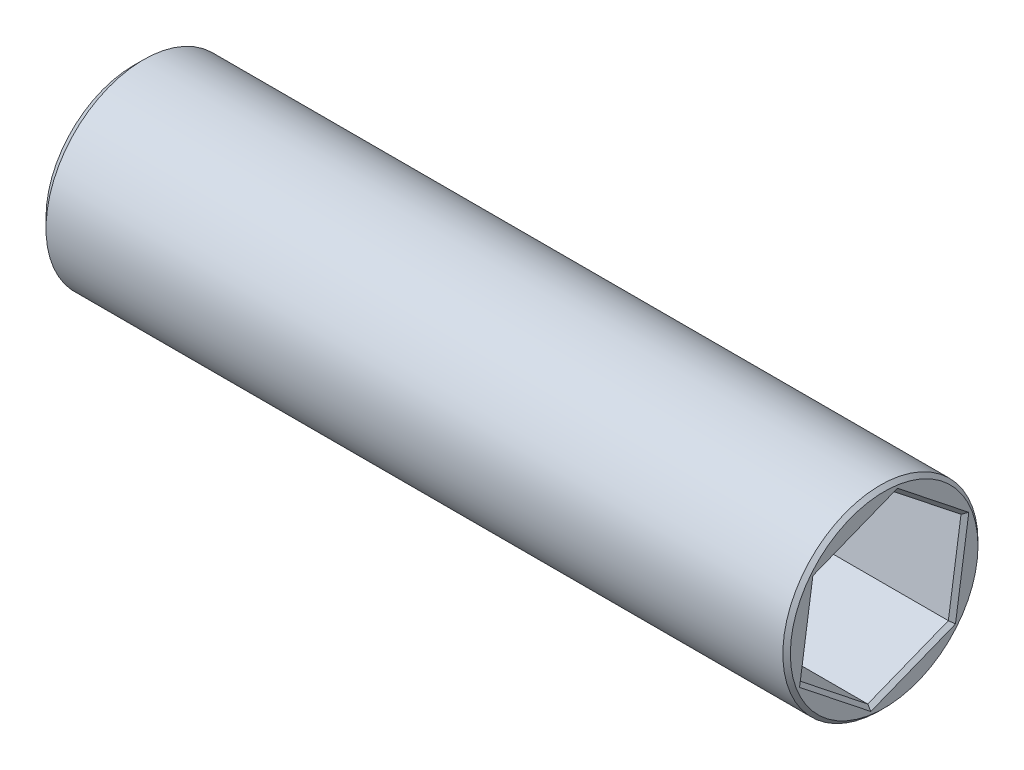
ISO-10303-21;
HEADER;
FILE_DESCRIPTION(('STEP AP214'),'2;1');
FILE_NAME('part.step','',(''),(''),'','','');
FILE_SCHEMA(('AUTOMOTIVE_DESIGN { 1 0 10303 214 1 1 1 1 }'));
ENDSEC;
DATA;
#1=APPLICATION_CONTEXT('core data for automotive mechanical design processes');
#2=APPLICATION_PROTOCOL_DEFINITION('international standard','automotive_design',2000,#1);
#3=PRODUCT_CONTEXT('',#1,'mechanical');
#4=PRODUCT('Part','Part','',(#3));
#5=PRODUCT_RELATED_PRODUCT_CATEGORY('part','',(#4));
#6=PRODUCT_DEFINITION_FORMATION('','',#4);
#7=PRODUCT_DEFINITION_CONTEXT('part definition',#1,'design');
#8=PRODUCT_DEFINITION('design','',#6,#7);
#9=PRODUCT_DEFINITION_SHAPE('','',#8);
#10=(LENGTH_UNIT() NAMED_UNIT(*) SI_UNIT(.MILLI.,.METRE.));
#11=(NAMED_UNIT(*) PLANE_ANGLE_UNIT() SI_UNIT($,.RADIAN.));
#12=(NAMED_UNIT(*) SI_UNIT($,.STERADIAN.) SOLID_ANGLE_UNIT());
#13=UNCERTAINTY_MEASURE_WITH_UNIT(LENGTH_MEASURE(1.E-05),#10,'distance_accuracy_value','');
#14=(GEOMETRIC_REPRESENTATION_CONTEXT(3) GLOBAL_UNCERTAINTY_ASSIGNED_CONTEXT((#13)) GLOBAL_UNIT_ASSIGNED_CONTEXT((#10,
#11,#12)) REPRESENTATION_CONTEXT('',''));
#15=CARTESIAN_POINT('',(0.,0.,0.));
#16=DIRECTION('',(0.,0.,1.));
#17=DIRECTION('',(1.,0.,0.));
#18=AXIS2_PLACEMENT_3D('',#15,#16,#17);
#19=CARTESIAN_POINT('',(30.,0.,0.));
#20=DIRECTION('',(-1.,0.,0.));
#21=DIRECTION('',(0.,0.,1.));
#22=AXIS2_PLACEMENT_3D('',#19,#20,#21);
#23=CYLINDRICAL_SURFACE('',#22,1.575);
#24=CARTESIAN_POINT('',(0.400000000000005,0.,0.));
#25=DIRECTION('',(1.,0.,0.));
#26=DIRECTION('',(0.,0.,-1.));
#27=AXIS2_PLACEMENT_3D('',#24,#25,#26);
#28=CIRCLE('',#27,1.575);
#29=CARTESIAN_POINT('',(0.400000000000005,0.,-1.575));
#30=VERTEX_POINT('',#29);
#31=EDGE_CURVE('E167',#30,#30,#28,.F.);
#32=ORIENTED_EDGE('',*,*,#31,.T.);
#33=EDGE_LOOP('',(#32));
#34=FACE_BOUND('',#33,.T.);
#35=CARTESIAN_POINT('',(5.,0.,0.));
#36=DIRECTION('',(1.,0.,0.));
#37=DIRECTION('',(0.,0.,-1.));
#38=AXIS2_PLACEMENT_3D('',#35,#36,#37);
#39=CIRCLE('',#38,1.575);
#40=CARTESIAN_POINT('',(5.,0.,-1.575));
#41=VERTEX_POINT('',#40);
#42=EDGE_CURVE('E149',#41,#41,#39,.T.);
#43=ORIENTED_EDGE('',*,*,#42,.T.);
#44=EDGE_LOOP('',(#43));
#45=FACE_BOUND('',#44,.T.);
#46=ADVANCED_FACE('F43',(#34,#45),#23,.F.);
#47=CARTESIAN_POINT('',(30.,0.,0.));
#48=DIRECTION('',(1.,0.,0.));
#49=DIRECTION('',(0.,0.,-1.));
#50=AXIS2_PLACEMENT_3D('',#47,#48,#49);
#51=PLANE('',#50);
#52=CARTESIAN_POINT('',(30.,0.,0.));
#53=DIRECTION('',(1.,0.,0.));
#54=DIRECTION('',(0.,0.,-1.));
#55=AXIS2_PLACEMENT_3D('',#52,#53,#54);
#56=CIRCLE('',#55,3.75);
#57=CARTESIAN_POINT('',(30.,0.,-3.75));
#58=VERTEX_POINT('',#57);
#59=EDGE_CURVE('E194',#58,#58,#56,.T.);
#60=ORIENTED_EDGE('',*,*,#59,.T.);
#61=EDGE_LOOP('',(#60));
#62=FACE_BOUND('',#61,.T.);
#63=DIRECTION('',(0.,0.989246253884702,-0.146259526784012));
#64=VECTOR('',#63,1.);
#65=CARTESIAN_POINT('',(30.,2.17414228229512,2.86279676825592));
#66=LINE('',#65,#64);
#67=CARTESIAN_POINT('',(30.,-1.33837850220212,3.38212107779175));
#68=VERTEX_POINT('',#67);
#69=CARTESIAN_POINT('',(30.,2.2598135209414,2.85013032168188));
#70=VERTEX_POINT('',#69);
#71=EDGE_CURVE('E187',#68,#70,#66,.T.);
#72=ORIENTED_EDGE('',*,*,#71,.T.);
#73=DIRECTION('',(0.,0.367958661201907,-0.929842149854749));
#74=VECTOR('',#73,1.);
#75=CARTESIAN_POINT('',(30.,3.56632586832918,-0.451464063781495));
#76=LINE('',#75,#74);
#77=CARTESIAN_POINT('',(30.,3.59819202314352,-0.531990756109868));
#78=VERTEX_POINT('',#77);
#79=EDGE_CURVE('E190',#70,#78,#76,.T.);
#80=ORIENTED_EDGE('',*,*,#79,.T.);
#81=DIRECTION('',(0.,-0.621287592682796,-0.783582623070737));
#82=VECTOR('',#81,1.);
#83=CARTESIAN_POINT('',(30.,1.39218358603406,-3.31426083203742));
#84=LINE('',#83,#82);
#85=CARTESIAN_POINT('',(30.,1.33837850220212,-3.38212107779175));
#86=VERTEX_POINT('',#85);
#87=EDGE_CURVE('E175',#78,#86,#84,.T.);
#88=ORIENTED_EDGE('',*,*,#87,.T.);
#89=DIRECTION('',(0.,-0.989246253884702,0.146259526784012));
#90=VECTOR('',#89,1.);
#91=CARTESIAN_POINT('',(30.,-2.17414228229512,-2.86279676825592));
#92=LINE('',#91,#90);
#93=CARTESIAN_POINT('',(30.,-2.2598135209414,-2.85013032168188));
#94=VERTEX_POINT('',#93);
#95=EDGE_CURVE('E178',#86,#94,#92,.T.);
#96=ORIENTED_EDGE('',*,*,#95,.T.);
#97=DIRECTION('',(0.,-0.367958661201906,0.929842149854749));
#98=VECTOR('',#97,1.);
#99=CARTESIAN_POINT('',(30.,-3.56632586832918,0.451464063781495));
#100=LINE('',#99,#98);
#101=CARTESIAN_POINT('',(30.,-3.59819202314352,0.531990756109869));
#102=VERTEX_POINT('',#101);
#103=EDGE_CURVE('E181',#94,#102,#100,.T.);
#104=ORIENTED_EDGE('',*,*,#103,.T.);
#105=DIRECTION('',(0.,0.621287592682796,0.783582623070737));
#106=VECTOR('',#105,1.);
#107=CARTESIAN_POINT('',(30.,-1.39218358603406,3.31426083203742));
#108=LINE('',#107,#106);
#109=EDGE_CURVE('E184',#102,#68,#108,.T.);
#110=ORIENTED_EDGE('',*,*,#109,.T.);
#111=EDGE_LOOP('',(#72,#80,#88,#96,#104,#110));
#112=FACE_BOUND('',#111,.T.);
#113=ADVANCED_FACE('F263',(#62,#112),#51,.T.);
#114=CARTESIAN_POINT('',(0.,0.,0.));
#115=DIRECTION('',(1.,0.,0.));
#116=DIRECTION('',(0.,0.,-1.));
#117=AXIS2_PLACEMENT_3D('',#114,#115,#116);
#118=PLANE('',#117);
#119=CARTESIAN_POINT('',(0.,0.,0.));
#120=DIRECTION('',(1.,0.,0.));
#121=DIRECTION('',(0.,0.,-1.));
#122=AXIS2_PLACEMENT_3D('',#119,#120,#121);
#123=CIRCLE('',#122,1.975);
#124=CARTESIAN_POINT('',(0.,0.,-1.975));
#125=VERTEX_POINT('',#124);
#126=EDGE_CURVE('E163',#125,#125,#123,.T.);
#127=ORIENTED_EDGE('',*,*,#126,.T.);
#128=EDGE_LOOP('',(#127));
#129=FACE_BOUND('',#128,.T.);
#130=CARTESIAN_POINT('',(0.,0.,0.));
#131=DIRECTION('',(1.,0.,0.));
#132=DIRECTION('',(0.,0.,-1.));
#133=AXIS2_PLACEMENT_3D('',#130,#131,#132);
#134=CIRCLE('',#133,3.5);
#135=CARTESIAN_POINT('',(0.,0.,-3.5));
#136=VERTEX_POINT('',#135);
#137=EDGE_CURVE('E154',#136,#136,#134,.F.);
#138=ORIENTED_EDGE('',*,*,#137,.T.);
#139=EDGE_LOOP('',(#138));
#140=FACE_BOUND('',#139,.T.);
#141=ADVANCED_FACE('F282',(#129,#140),#118,.F.);
#142=CARTESIAN_POINT('',(30.,0.,0.));
#143=DIRECTION('',(-1.,0.,0.));
#144=DIRECTION('',(0.,0.,1.));
#145=AXIS2_PLACEMENT_3D('',#142,#143,#144);
#146=CYLINDRICAL_SURFACE('',#145,3.9);
#147=CARTESIAN_POINT('',(29.85,0.,0.));
#148=DIRECTION('',(1.,0.,0.));
#149=DIRECTION('',(0.,0.,-1.));
#150=AXIS2_PLACEMENT_3D('',#147,#148,#149);
#151=CIRCLE('',#150,3.9);
#152=CARTESIAN_POINT('',(29.85,0.,-3.9));
#153=VERTEX_POINT('',#152);
#154=EDGE_CURVE('E198',#153,#153,#151,.F.);
#155=ORIENTED_EDGE('',*,*,#154,.T.);
#156=EDGE_LOOP('',(#155));
#157=FACE_BOUND('',#156,.T.);
#158=CARTESIAN_POINT('',(0.399999999999998,0.,0.));
#159=DIRECTION('',(1.,0.,0.));
#160=DIRECTION('',(0.,0.,-1.));
#161=AXIS2_PLACEMENT_3D('',#158,#159,#160);
#162=CIRCLE('',#161,3.9);
#163=CARTESIAN_POINT('',(0.399999999999998,0.,-3.9));
#164=VERTEX_POINT('',#163);
#165=EDGE_CURVE('E171',#164,#164,#162,.T.);
#166=ORIENTED_EDGE('',*,*,#165,.T.);
#167=EDGE_LOOP('',(#166));
#168=FACE_BOUND('',#167,.T.);
#169=ADVANCED_FACE('F292',(#157,#168),#146,.T.);
#170=CARTESIAN_POINT('',(-9.4060777997329,1.27464619257345,-3.221067693135));
#171=DIRECTION('',(0.,0.783582623070736,-0.621287592682796));
#172=DIRECTION('',(0.,0.621287592682796,0.783582623070736));
#173=AXIS2_PLACEMENT_3D('',#170,#171,#172);
#174=PLANE('',#173);
#175=DIRECTION('',(1.,0.,0.));
#176=VECTOR('',#175,1.);
#177=CARTESIAN_POINT('',(-9.4060777997329,1.27464619257345,-3.221067693135));
#178=LINE('',#177,#176);
#179=CARTESIAN_POINT('',(5.,1.27464619257345,-3.221067693135));
#180=VERTEX_POINT('',#179);
#181=CARTESIAN_POINT('',(29.85,1.27464619257345,-3.221067693135));
#182=VERTEX_POINT('',#181);
#183=EDGE_CURVE('E131',#180,#182,#178,.T.);
#184=ORIENTED_EDGE('',*,*,#183,.T.);
#185=DIRECTION('',(0.,0.621287592682796,0.783582623070736));
#186=VECTOR('',#185,1.);
#187=CARTESIAN_POINT('',(29.85,3.42684954585097,-0.506657862961781));
#188=LINE('',#187,#186);
#189=CARTESIAN_POINT('',(29.85,3.42684954585097,-0.506657862961781));
#190=VERTEX_POINT('',#189);
#191=EDGE_CURVE('E12',#182,#190,#188,.T.);
#192=ORIENTED_EDGE('',*,*,#191,.T.);
#193=DIRECTION('',(1.,0.,0.));
#194=VECTOR('',#193,1.);
#195=CARTESIAN_POINT('',(-9.4060777997329,3.42684954585097,-0.506657862961781));
#196=LINE('',#195,#194);
#197=CARTESIAN_POINT('',(5.,3.42684954585097,-0.506657862961781));
#198=VERTEX_POINT('',#197);
#199=EDGE_CURVE('E142',#198,#190,#196,.T.);
#200=ORIENTED_EDGE('',*,*,#199,.F.);
#201=DIRECTION('',(0.,-0.621287592682796,-0.783582623070736));
#202=VECTOR('',#201,1.);
#203=CARTESIAN_POINT('',(5.,1.27464619257345,-3.221067693135));
#204=LINE('',#203,#202);
#205=EDGE_CURVE('E146',#198,#180,#204,.T.);
#206=ORIENTED_EDGE('',*,*,#205,.T.);
#207=EDGE_LOOP('',(#184,#192,#200,#206));
#208=FACE_BOUND('',#207,.T.);
#209=ADVANCED_FACE('F287',(#208),#174,.F.);
#210=CARTESIAN_POINT('',(-9.4060777997329,-2.15220335327752,-2.71440983017322));
#211=DIRECTION('',(0.,-0.146259526784012,-0.989246253884702));
#212=DIRECTION('',(0.,0.989246253884702,-0.146259526784012));
#213=AXIS2_PLACEMENT_3D('',#210,#211,#212);
#214=PLANE('',#213);
#215=DIRECTION('',(1.,0.,0.));
#216=VECTOR('',#215,1.);
#217=CARTESIAN_POINT('',(-9.4060777997329,-2.15220335327752,-2.71440983017322));
#218=LINE('',#217,#216);
#219=CARTESIAN_POINT('',(5.,-2.15220335327752,-2.71440983017322));
#220=VERTEX_POINT('',#219);
#221=CARTESIAN_POINT('',(29.85,-2.15220335327752,-2.71440983017322));
#222=VERTEX_POINT('',#221);
#223=EDGE_CURVE('E470',#220,#222,#218,.T.);
#224=ORIENTED_EDGE('',*,*,#223,.T.);
#225=DIRECTION('',(0.,0.989246253884702,-0.146259526784012));
#226=VECTOR('',#225,1.);
#227=CARTESIAN_POINT('',(29.85,1.27464619257345,-3.221067693135));
#228=LINE('',#227,#226);
#229=EDGE_CURVE('E54',#222,#182,#228,.T.);
#230=ORIENTED_EDGE('',*,*,#229,.T.);
#231=ORIENTED_EDGE('',*,*,#183,.F.);
#232=DIRECTION('',(0.,-0.989246253884702,0.146259526784012));
#233=VECTOR('',#232,1.);
#234=CARTESIAN_POINT('',(5.,-2.15220335327752,-2.71440983017322));
#235=LINE('',#234,#233);
#236=EDGE_CURVE('E156',#180,#220,#235,.T.);
#237=ORIENTED_EDGE('',*,*,#236,.T.);
#238=EDGE_LOOP('',(#224,#230,#231,#237));
#239=FACE_BOUND('',#238,.T.);
#240=ADVANCED_FACE('F423',(#239),#214,.F.);
#241=CARTESIAN_POINT('',(-9.4060777997329,-3.42684954585097,0.50665786296178));
#242=DIRECTION('',(0.,-0.929842149854749,-0.367958661201906));
#243=DIRECTION('',(0.,0.367958661201906,-0.929842149854749));
#244=AXIS2_PLACEMENT_3D('',#241,#242,#243);
#245=PLANE('',#244);
#246=DIRECTION('',(1.,0.,0.));
#247=VECTOR('',#246,1.);
#248=CARTESIAN_POINT('',(-9.4060777997329,-3.42684954585097,0.50665786296178));
#249=LINE('',#248,#247);
#250=CARTESIAN_POINT('',(5.,-3.42684954585097,0.50665786296178));
#251=VERTEX_POINT('',#250);
#252=CARTESIAN_POINT('',(29.85,-3.42684954585097,0.50665786296178));
#253=VERTEX_POINT('',#252);
#254=EDGE_CURVE('E259',#251,#253,#249,.T.);
#255=ORIENTED_EDGE('',*,*,#254,.T.);
#256=DIRECTION('',(0.,0.367958661201906,-0.929842149854749));
#257=VECTOR('',#256,1.);
#258=CARTESIAN_POINT('',(29.85,-2.15220335327752,-2.71440983017322));
#259=LINE('',#258,#257);
#260=EDGE_CURVE('E69',#253,#222,#259,.T.);
#261=ORIENTED_EDGE('',*,*,#260,.T.);
#262=ORIENTED_EDGE('',*,*,#223,.F.);
#263=DIRECTION('',(0.,-0.367958661201906,0.929842149854749));
#264=VECTOR('',#263,1.);
#265=CARTESIAN_POINT('',(5.,-3.42684954585097,0.50665786296178));
#266=LINE('',#265,#264);
#267=EDGE_CURVE('E478',#220,#251,#266,.T.);
#268=ORIENTED_EDGE('',*,*,#267,.T.);
#269=EDGE_LOOP('',(#255,#261,#262,#268));
#270=FACE_BOUND('',#269,.T.);
#271=ADVANCED_FACE('F415',(#270),#245,.F.);
#272=CARTESIAN_POINT('',(-9.4060777997329,-1.27464619257345,3.221067693135));
#273=DIRECTION('',(0.,-0.783582623070737,0.621287592682796));
#274=DIRECTION('',(0.,-0.621287592682796,-0.783582623070737));
#275=AXIS2_PLACEMENT_3D('',#272,#273,#274);
#276=PLANE('',#275);
#277=DIRECTION('',(1.,0.,0.));
#278=VECTOR('',#277,1.);
#279=CARTESIAN_POINT('',(-9.4060777997329,-1.27464619257345,3.221067693135));
#280=LINE('',#279,#278);
#281=CARTESIAN_POINT('',(5.,-1.27464619257345,3.221067693135));
#282=VERTEX_POINT('',#281);
#283=CARTESIAN_POINT('',(29.85,-1.27464619257345,3.221067693135));
#284=VERTEX_POINT('',#283);
#285=EDGE_CURVE('E125',#282,#284,#280,.T.);
#286=ORIENTED_EDGE('',*,*,#285,.T.);
#287=DIRECTION('',(0.,-0.621287592682796,-0.783582623070737));
#288=VECTOR('',#287,1.);
#289=CARTESIAN_POINT('',(29.85,-3.42684954585097,0.50665786296178));
#290=LINE('',#289,#288);
#291=EDGE_CURVE('E207',#284,#253,#290,.T.);
#292=ORIENTED_EDGE('',*,*,#291,.T.);
#293=ORIENTED_EDGE('',*,*,#254,.F.);
#294=DIRECTION('',(0.,0.621287592682796,0.783582623070737));
#295=VECTOR('',#294,1.);
#296=CARTESIAN_POINT('',(5.,-1.27464619257345,3.221067693135));
#297=LINE('',#296,#295);
#298=EDGE_CURVE('E130',#251,#282,#297,.T.);
#299=ORIENTED_EDGE('',*,*,#298,.T.);
#300=EDGE_LOOP('',(#286,#292,#293,#299));
#301=FACE_BOUND('',#300,.T.);
#302=ADVANCED_FACE('F256',(#301),#276,.F.);
#303=CARTESIAN_POINT('',(-9.4060777997329,2.15220335327752,2.71440983017322));
#304=DIRECTION('',(0.,0.146259526784012,0.989246253884702));
#305=DIRECTION('',(0.,-0.989246253884702,0.146259526784012));
#306=AXIS2_PLACEMENT_3D('',#303,#304,#305);
#307=PLANE('',#306);
#308=DIRECTION('',(1.,0.,0.));
#309=VECTOR('',#308,1.);
#310=CARTESIAN_POINT('',(-9.4060777997329,2.15220335327752,2.71440983017322));
#311=LINE('',#310,#309);
#312=CARTESIAN_POINT('',(5.,2.15220335327752,2.71440983017322));
#313=VERTEX_POINT('',#312);
#314=CARTESIAN_POINT('',(29.85,2.15220335327752,2.71440983017322));
#315=VERTEX_POINT('',#314);
#316=EDGE_CURVE('E123',#313,#315,#311,.T.);
#317=ORIENTED_EDGE('',*,*,#316,.T.);
#318=DIRECTION('',(0.,-0.989246253884702,0.146259526784012));
#319=VECTOR('',#318,1.);
#320=CARTESIAN_POINT('',(29.85,-1.27464619257345,3.221067693135));
#321=LINE('',#320,#319);
#322=EDGE_CURVE('E204',#315,#284,#321,.T.);
#323=ORIENTED_EDGE('',*,*,#322,.T.);
#324=ORIENTED_EDGE('',*,*,#285,.F.);
#325=DIRECTION('',(0.,0.989246253884702,-0.146259526784012));
#326=VECTOR('',#325,1.);
#327=CARTESIAN_POINT('',(5.,2.15220335327752,2.71440983017322));
#328=LINE('',#327,#326);
#329=EDGE_CURVE('E120',#282,#313,#328,.T.);
#330=ORIENTED_EDGE('',*,*,#329,.T.);
#331=EDGE_LOOP('',(#317,#323,#324,#330));
#332=FACE_BOUND('',#331,.T.);
#333=ADVANCED_FACE('F122',(#332),#307,.F.);
#334=CARTESIAN_POINT('',(-9.4060777997329,3.42684954585097,-0.506657862961781));
#335=DIRECTION('',(0.,0.929842149854749,0.367958661201906));
#336=DIRECTION('',(0.,-0.367958661201906,0.929842149854749));
#337=AXIS2_PLACEMENT_3D('',#334,#335,#336);
#338=PLANE('',#337);
#339=ORIENTED_EDGE('',*,*,#199,.T.);
#340=DIRECTION('',(0.,-0.367958661201906,0.929842149854749));
#341=VECTOR('',#340,1.);
#342=CARTESIAN_POINT('',(29.85,2.15220335327752,2.71440983017322));
#343=LINE('',#342,#341);
#344=EDGE_CURVE('E140',#190,#315,#343,.T.);
#345=ORIENTED_EDGE('',*,*,#344,.T.);
#346=ORIENTED_EDGE('',*,*,#316,.F.);
#347=DIRECTION('',(0.,0.367958661201906,-0.929842149854749));
#348=VECTOR('',#347,1.);
#349=CARTESIAN_POINT('',(5.,3.42684954585097,-0.506657862961781));
#350=LINE('',#349,#348);
#351=EDGE_CURVE('E137',#313,#198,#350,.T.);
#352=ORIENTED_EDGE('',*,*,#351,.T.);
#353=EDGE_LOOP('',(#339,#345,#346,#352));
#354=FACE_BOUND('',#353,.T.);
#355=ADVANCED_FACE('F136',(#354),#338,.F.);
#356=CARTESIAN_POINT('',(5.,0.,0.));
#357=DIRECTION('',(1.,0.,0.));
#358=DIRECTION('',(0.,0.,-1.));
#359=AXIS2_PLACEMENT_3D('',#356,#357,#358);
#360=PLANE('',#359);
#361=ORIENTED_EDGE('',*,*,#42,.F.);
#362=EDGE_LOOP('',(#361));
#363=FACE_BOUND('',#362,.T.);
#364=ORIENTED_EDGE('',*,*,#205,.F.);
#365=ORIENTED_EDGE('',*,*,#351,.F.);
#366=ORIENTED_EDGE('',*,*,#329,.F.);
#367=ORIENTED_EDGE('',*,*,#298,.F.);
#368=ORIENTED_EDGE('',*,*,#267,.F.);
#369=ORIENTED_EDGE('',*,*,#236,.F.);
#370=EDGE_LOOP('',(#364,#365,#366,#367,#368,#369));
#371=FACE_BOUND('',#370,.T.);
#372=ADVANCED_FACE('F144',(#363,#371),#360,.T.);
#373=CARTESIAN_POINT('',(0.,0.,0.));
#374=DIRECTION('',(-1.,0.,0.));
#375=DIRECTION('',(0.,0.,1.));
#376=AXIS2_PLACEMENT_3D('',#373,#374,#375);
#377=CONICAL_SURFACE('',#376,1.975,0.785398163397444);
#378=ORIENTED_EDGE('',*,*,#31,.F.);
#379=EDGE_LOOP('',(#378));
#380=FACE_BOUND('',#379,.T.);
#381=ORIENTED_EDGE('',*,*,#126,.F.);
#382=EDGE_LOOP('',(#381));
#383=FACE_BOUND('',#382,.T.);
#384=ADVANCED_FACE('F298',(#380,#383),#377,.F.);
#385=CARTESIAN_POINT('',(0.399999999999998,0.,0.));
#386=DIRECTION('',(1.,0.,0.));
#387=DIRECTION('',(0.,0.,-1.));
#388=AXIS2_PLACEMENT_3D('',#385,#386,#387);
#389=CONICAL_SURFACE('',#388,3.9,0.785398163397448);
#390=ORIENTED_EDGE('',*,*,#137,.F.);
#391=EDGE_LOOP('',(#390));
#392=FACE_BOUND('',#391,.T.);
#393=ORIENTED_EDGE('',*,*,#165,.F.);
#394=EDGE_LOOP('',(#393));
#395=FACE_BOUND('',#394,.T.);
#396=ADVANCED_FACE('F304',(#392,#395),#389,.T.);
#397=CARTESIAN_POINT('',(30.,0.,0.));
#398=DIRECTION('',(-1.,0.,0.));
#399=DIRECTION('',(0.,0.,1.));
#400=AXIS2_PLACEMENT_3D('',#397,#398,#399);
#401=CONICAL_SURFACE('',#400,3.75,0.785398163397458);
#402=ORIENTED_EDGE('',*,*,#154,.F.);
#403=EDGE_LOOP('',(#402));
#404=FACE_BOUND('',#403,.T.);
#405=ORIENTED_EDGE('',*,*,#59,.F.);
#406=EDGE_LOOP('',(#405));
#407=FACE_BOUND('',#406,.T.);
#408=ADVANCED_FACE('F274',(#404,#407),#401,.T.);
#409=CARTESIAN_POINT('',(29.85,-3.42684954585097,0.50665786296178));
#410=DIRECTION('',(0.707106781186534,0.657497689595383,0.260186064532196));
#411=DIRECTION('',(0.,-0.367958661201906,0.929842149854749));
#412=AXIS2_PLACEMENT_3D('',#409,#410,#411);
#413=PLANE('',#412);
#414=DIRECTION('',(0.654653670707992,-0.747799878051755,0.110561809926992));
#415=VECTOR('',#414,1.);
#416=CARTESIAN_POINT('',(28.9928571428571,-2.44774967560787,0.361898473544135));
#417=LINE('',#416,#415);
#418=EDGE_CURVE('E227',#102,#253,#417,.F.);
#419=ORIENTED_EDGE('',*,*,#418,.F.);
#420=ORIENTED_EDGE('',*,*,#103,.F.);
#421=DIRECTION('',(0.654653670707992,-0.469649275111042,-0.592332786376227));
#422=VECTOR('',#421,1.);
#423=CARTESIAN_POINT('',(28.9928571428571,-1.53728810948396,-1.93886416440947));
#424=LINE('',#423,#422);
#425=EDGE_CURVE('E48',#222,#94,#424,.T.);
#426=ORIENTED_EDGE('',*,*,#425,.F.);
#427=ORIENTED_EDGE('',*,*,#260,.F.);
#428=EDGE_LOOP('',(#419,#420,#426,#427));
#429=FACE_BOUND('',#428,.T.);
#430=ADVANCED_FACE('F46',(#429),#413,.T.);
#431=CARTESIAN_POINT('',(29.85,-2.15220335327752,-2.71440983017322));
#432=DIRECTION('',(0.707106781186533,0.103421103202112,0.699502734385276));
#433=DIRECTION('',(0.,-0.989246253884702,0.146259526784012));
#434=AXIS2_PLACEMENT_3D('',#431,#432,#433);
#435=PLANE('',#434);
#436=ORIENTED_EDGE('',*,*,#425,.T.);
#437=ORIENTED_EDGE('',*,*,#95,.F.);
#438=DIRECTION('',(0.654653670707993,0.278150602940711,-0.702894596303222));
#439=VECTOR('',#438,1.);
#440=CARTESIAN_POINT('',(28.9928571428571,0.910461566123912,-2.30076263795361));
#441=LINE('',#440,#439);
#442=EDGE_CURVE('E224',#182,#86,#441,.T.);
#443=ORIENTED_EDGE('',*,*,#442,.F.);
#444=ORIENTED_EDGE('',*,*,#229,.F.);
#445=EDGE_LOOP('',(#436,#437,#443,#444));
#446=FACE_BOUND('',#445,.T.);
#447=ADVANCED_FACE('F267',(#446),#435,.T.);
#448=CARTESIAN_POINT('',(29.85,-1.27464619257345,3.221067693135));
#449=DIRECTION('',(0.707106781186533,0.554076586393272,-0.43931666985308));
#450=DIRECTION('',(0.,0.621287592682796,0.783582623070737));
#451=AXIS2_PLACEMENT_3D('',#448,#449,#450);
#452=PLANE('',#451);
#453=ORIENTED_EDGE('',*,*,#418,.T.);
#454=ORIENTED_EDGE('',*,*,#291,.F.);
#455=DIRECTION('',(0.654653670707992,-0.278150602940713,0.702894596303222));
#456=VECTOR('',#455,1.);
#457=CARTESIAN_POINT('',(28.9928571428571,-0.910461566123907,2.3007626379536));
#458=LINE('',#457,#456);
#459=EDGE_CURVE('E220',#68,#284,#458,.F.);
#460=ORIENTED_EDGE('',*,*,#459,.F.);
#461=ORIENTED_EDGE('',*,*,#109,.F.);
#462=EDGE_LOOP('',(#453,#454,#460,#461));
#463=FACE_BOUND('',#462,.T.);
#464=ADVANCED_FACE('F261',(#463),#452,.T.);
#465=CARTESIAN_POINT('',(29.85,1.27464619257345,-3.221067693135));
#466=DIRECTION('',(0.707106781186532,-0.554076586393273,0.439316669853081));
#467=DIRECTION('',(0.,-0.621287592682796,-0.783582623070736));
#468=AXIS2_PLACEMENT_3D('',#465,#466,#467);
#469=PLANE('',#468);
#470=ORIENTED_EDGE('',*,*,#442,.T.);
#471=ORIENTED_EDGE('',*,*,#87,.F.);
#472=DIRECTION('',(-0.654653670707992,-0.747799878051756,0.110561809926988));
#473=VECTOR('',#472,1.);
#474=CARTESIAN_POINT('',(29.85,3.42684954585097,-0.506657862961781));
#475=LINE('',#474,#473);
#476=EDGE_CURVE('E217',#190,#78,#475,.F.);
#477=ORIENTED_EDGE('',*,*,#476,.F.);
#478=ORIENTED_EDGE('',*,*,#191,.F.);
#479=EDGE_LOOP('',(#470,#471,#477,#478));
#480=FACE_BOUND('',#479,.T.);
#481=ADVANCED_FACE('F245',(#480),#469,.T.);
#482=CARTESIAN_POINT('',(29.85,2.15220335327752,2.71440983017322));
#483=DIRECTION('',(0.707106781186534,-0.103421103202112,-0.699502734385276));
#484=DIRECTION('',(0.,0.989246253884702,-0.146259526784012));
#485=AXIS2_PLACEMENT_3D('',#482,#483,#484);
#486=PLANE('',#485);
#487=ORIENTED_EDGE('',*,*,#459,.T.);
#488=ORIENTED_EDGE('',*,*,#322,.F.);
#489=DIRECTION('',(0.654653670707991,0.469649275111044,0.592332786376227));
#490=VECTOR('',#489,1.);
#491=CARTESIAN_POINT('',(28.9928571428571,1.53728810948396,1.93886416440947));
#492=LINE('',#491,#490);
#493=EDGE_CURVE('E214',#70,#315,#492,.F.);
#494=ORIENTED_EDGE('',*,*,#493,.F.);
#495=ORIENTED_EDGE('',*,*,#71,.F.);
#496=EDGE_LOOP('',(#487,#488,#494,#495));
#497=FACE_BOUND('',#496,.T.);
#498=ADVANCED_FACE('F253',(#497),#486,.T.);
#499=CARTESIAN_POINT('',(29.85,3.42684954585097,-0.506657862961781));
#500=DIRECTION('',(0.707106781186535,-0.657497689595382,-0.260186064532196));
#501=DIRECTION('',(0.,0.367958661201906,-0.929842149854749));
#502=AXIS2_PLACEMENT_3D('',#499,#500,#501);
#503=PLANE('',#502);
#504=ORIENTED_EDGE('',*,*,#476,.T.);
#505=ORIENTED_EDGE('',*,*,#79,.F.);
#506=ORIENTED_EDGE('',*,*,#493,.T.);
#507=ORIENTED_EDGE('',*,*,#344,.F.);
#508=EDGE_LOOP('',(#504,#505,#506,#507));
#509=FACE_BOUND('',#508,.T.);
#510=ADVANCED_FACE('F248',(#509),#503,.T.);
#511=CLOSED_SHELL('',(#46,#113,#141,#169,#209,#240,#271,#302,#333,#355,#372,#384,#396,#408,#430,
#447,#464,#481,#498,#510));
#512=MANIFOLD_SOLID_BREP('B2',#511);
#513=ADVANCED_BREP_SHAPE_REPRESENTATION('',(#18,#512),#14);
#514=SHAPE_DEFINITION_REPRESENTATION(#9,#513);
ENDSEC;
END-ISO-10303-21;
